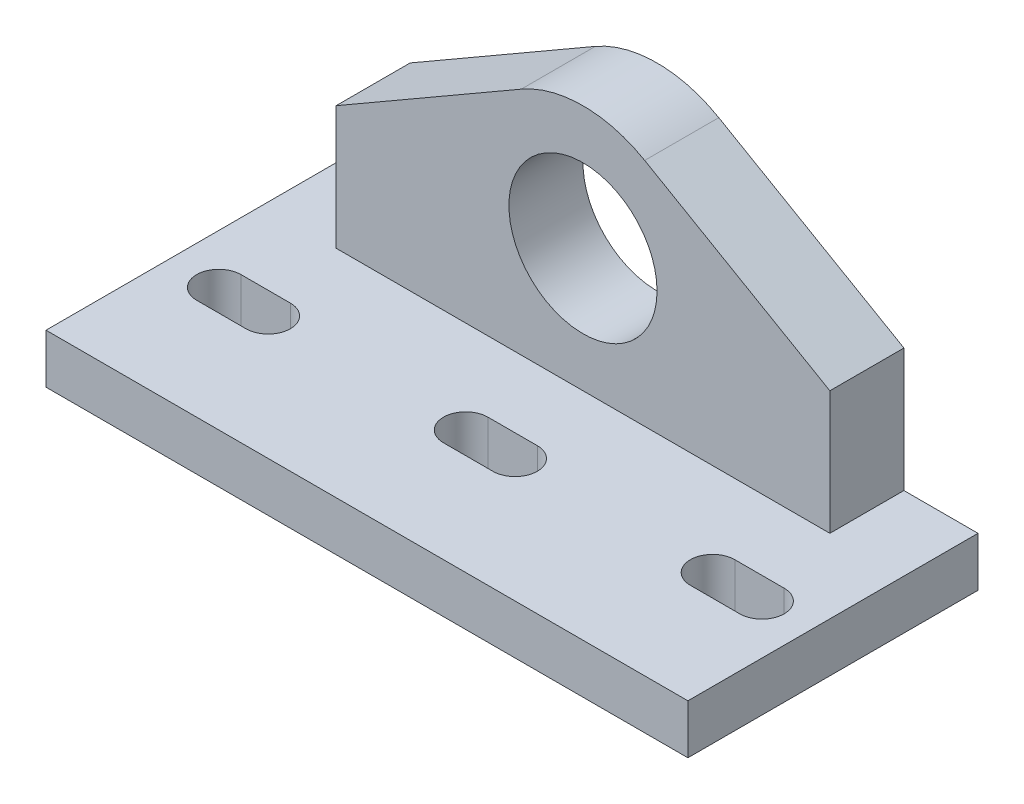
ISO-10303-21;
HEADER;
FILE_DESCRIPTION(('STEP AP214'),'2;1');
FILE_NAME('part.step','',(''),(''),'','','');
FILE_SCHEMA(('AUTOMOTIVE_DESIGN { 1 0 10303 214 1 1 1 1 }'));
ENDSEC;
DATA;
#1=APPLICATION_CONTEXT('core data for automotive mechanical design processes');
#2=APPLICATION_PROTOCOL_DEFINITION('international standard','automotive_design',2000,#1);
#3=PRODUCT_CONTEXT('',#1,'mechanical');
#4=PRODUCT('Part','Part','',(#3));
#5=PRODUCT_RELATED_PRODUCT_CATEGORY('part','',(#4));
#6=PRODUCT_DEFINITION_FORMATION('','',#4);
#7=PRODUCT_DEFINITION_CONTEXT('part definition',#1,'design');
#8=PRODUCT_DEFINITION('design','',#6,#7);
#9=PRODUCT_DEFINITION_SHAPE('','',#8);
#10=(LENGTH_UNIT() NAMED_UNIT(*) SI_UNIT(.MILLI.,.METRE.));
#11=(NAMED_UNIT(*) PLANE_ANGLE_UNIT() SI_UNIT($,.RADIAN.));
#12=(NAMED_UNIT(*) SI_UNIT($,.STERADIAN.) SOLID_ANGLE_UNIT());
#13=UNCERTAINTY_MEASURE_WITH_UNIT(LENGTH_MEASURE(1.E-05),#10,'distance_accuracy_value','');
#14=(GEOMETRIC_REPRESENTATION_CONTEXT(3) GLOBAL_UNCERTAINTY_ASSIGNED_CONTEXT((#13)) GLOBAL_UNIT_ASSIGNED_CONTEXT((#10,
#11,#12)) REPRESENTATION_CONTEXT('',''));
#15=CARTESIAN_POINT('',(0.,0.,0.));
#16=DIRECTION('',(0.,0.,1.));
#17=DIRECTION('',(1.,0.,0.));
#18=AXIS2_PLACEMENT_3D('',#15,#16,#17);
#19=CARTESIAN_POINT('',(220.,0.,76.5));
#20=DIRECTION('',(0.,0.,1.));
#21=DIRECTION('',(1.,0.,0.));
#22=AXIS2_PLACEMENT_3D('',#19,#20,#21);
#23=PLANE('',#22);
#24=DIRECTION('',(1.,0.,0.));
#25=VECTOR('',#24,1.);
#26=CARTESIAN_POINT('',(220.,20.,76.5));
#27=LINE('',#26,#25);
#28=CARTESIAN_POINT('',(220.,20.,76.5));
#29=VERTEX_POINT('',#28);
#30=CARTESIAN_POINT('',(240.,20.,76.5));
#31=VERTEX_POINT('',#30);
#32=EDGE_CURVE('E324',#29,#31,#27,.T.);
#33=ORIENTED_EDGE('',*,*,#32,.T.);
#34=DIRECTION('',(0.,1.,0.));
#35=VECTOR('',#34,1.);
#36=CARTESIAN_POINT('',(240.,0.,76.5));
#37=LINE('',#36,#35);
#38=CARTESIAN_POINT('',(240.,0.,76.5));
#39=VERTEX_POINT('',#38);
#40=EDGE_CURVE('E11',#39,#31,#37,.T.);
#41=ORIENTED_EDGE('',*,*,#40,.F.);
#42=DIRECTION('',(1.,0.,0.));
#43=VECTOR('',#42,1.);
#44=CARTESIAN_POINT('',(220.,0.,76.5));
#45=LINE('',#44,#43);
#46=CARTESIAN_POINT('',(220.,0.,76.5));
#47=VERTEX_POINT('',#46);
#48=EDGE_CURVE('E329',#47,#39,#45,.T.);
#49=ORIENTED_EDGE('',*,*,#48,.F.);
#50=DIRECTION('',(0.,1.,0.));
#51=VECTOR('',#50,1.);
#52=CARTESIAN_POINT('',(220.,0.,76.5));
#53=LINE('',#52,#51);
#54=EDGE_CURVE('E336',#47,#29,#53,.T.);
#55=ORIENTED_EDGE('',*,*,#54,.T.);
#56=EDGE_LOOP('',(#33,#41,#49,#55));
#57=FACE_BOUND('',#56,.T.);
#58=ADVANCED_FACE('F35',(#57),#23,.F.);
#59=CARTESIAN_POINT('',(240.,0.,67.5));
#60=DIRECTION('',(0.,1.,0.));
#61=DIRECTION('',(0.,0.,1.));
#62=AXIS2_PLACEMENT_3D('',#59,#60,#61);
#63=CYLINDRICAL_SURFACE('',#62,9.00000000000001);
#64=CARTESIAN_POINT('',(240.,20.,67.5));
#65=DIRECTION('',(0.,1.,0.));
#66=DIRECTION('',(0.,0.,1.));
#67=AXIS2_PLACEMENT_3D('',#64,#65,#66);
#68=CIRCLE('',#67,9.00000000000001);
#69=CARTESIAN_POINT('',(240.,20.,58.5));
#70=VERTEX_POINT('',#69);
#71=EDGE_CURVE('E321',#31,#70,#68,.T.);
#72=ORIENTED_EDGE('',*,*,#71,.T.);
#73=DIRECTION('',(0.,1.,0.));
#74=VECTOR('',#73,1.);
#75=CARTESIAN_POINT('',(240.,0.,58.5));
#76=LINE('',#75,#74);
#77=CARTESIAN_POINT('',(240.,0.,58.5));
#78=VERTEX_POINT('',#77);
#79=EDGE_CURVE('E42',#78,#70,#76,.T.);
#80=ORIENTED_EDGE('',*,*,#79,.F.);
#81=CARTESIAN_POINT('',(240.,0.,67.5));
#82=DIRECTION('',(0.,1.,0.));
#83=DIRECTION('',(0.,0.,1.));
#84=AXIS2_PLACEMENT_3D('',#81,#82,#83);
#85=CIRCLE('',#84,9.00000000000001);
#86=EDGE_CURVE('E331',#39,#78,#85,.T.);
#87=ORIENTED_EDGE('',*,*,#86,.F.);
#88=ORIENTED_EDGE('',*,*,#40,.T.);
#89=EDGE_LOOP('',(#72,#80,#87,#88));
#90=FACE_BOUND('',#89,.T.);
#91=ADVANCED_FACE('F349',(#90),#63,.F.);
#92=CARTESIAN_POINT('',(220.,0.,58.5));
#93=DIRECTION('',(0.,0.,-1.));
#94=DIRECTION('',(-1.,0.,0.));
#95=AXIS2_PLACEMENT_3D('',#92,#93,#94);
#96=PLANE('',#95);
#97=DIRECTION('',(-1.,0.,0.));
#98=VECTOR('',#97,1.);
#99=CARTESIAN_POINT('',(220.,20.,58.5));
#100=LINE('',#99,#98);
#101=CARTESIAN_POINT('',(220.,20.,58.5));
#102=VERTEX_POINT('',#101);
#103=EDGE_CURVE('E318',#70,#102,#100,.T.);
#104=ORIENTED_EDGE('',*,*,#103,.T.);
#105=DIRECTION('',(0.,1.,0.));
#106=VECTOR('',#105,1.);
#107=CARTESIAN_POINT('',(220.,0.,58.5));
#108=LINE('',#107,#106);
#109=CARTESIAN_POINT('',(220.,0.,58.5));
#110=VERTEX_POINT('',#109);
#111=EDGE_CURVE('E339',#110,#102,#108,.T.);
#112=ORIENTED_EDGE('',*,*,#111,.F.);
#113=DIRECTION('',(-1.,0.,0.));
#114=VECTOR('',#113,1.);
#115=CARTESIAN_POINT('',(220.,0.,58.5));
#116=LINE('',#115,#114);
#117=EDGE_CURVE('E333',#78,#110,#116,.T.);
#118=ORIENTED_EDGE('',*,*,#117,.F.);
#119=ORIENTED_EDGE('',*,*,#79,.T.);
#120=EDGE_LOOP('',(#104,#112,#118,#119));
#121=FACE_BOUND('',#120,.T.);
#122=ADVANCED_FACE('F345',(#121),#96,.F.);
#123=CARTESIAN_POINT('',(220.,0.,67.5));
#124=DIRECTION('',(0.,1.,0.));
#125=DIRECTION('',(0.,0.,1.));
#126=AXIS2_PLACEMENT_3D('',#123,#124,#125);
#127=CYLINDRICAL_SURFACE('',#126,9.00000000000001);
#128=CARTESIAN_POINT('',(220.,20.,67.5));
#129=DIRECTION('',(0.,1.,0.));
#130=DIRECTION('',(0.,0.,1.));
#131=AXIS2_PLACEMENT_3D('',#128,#129,#130);
#132=CIRCLE('',#131,9.00000000000001);
#133=EDGE_CURVE('E316',#102,#29,#132,.T.);
#134=ORIENTED_EDGE('',*,*,#133,.T.);
#135=ORIENTED_EDGE('',*,*,#54,.F.);
#136=CARTESIAN_POINT('',(220.,0.,67.5));
#137=DIRECTION('',(0.,1.,0.));
#138=DIRECTION('',(0.,0.,1.));
#139=AXIS2_PLACEMENT_3D('',#136,#137,#138);
#140=CIRCLE('',#139,9.00000000000001);
#141=EDGE_CURVE('E327',#110,#47,#140,.T.);
#142=ORIENTED_EDGE('',*,*,#141,.F.);
#143=ORIENTED_EDGE('',*,*,#111,.T.);
#144=EDGE_LOOP('',(#134,#135,#142,#143));
#145=FACE_BOUND('',#144,.T.);
#146=ADVANCED_FACE('F358',(#145),#127,.F.);
#147=CARTESIAN_POINT('',(0.,20.,0.));
#148=DIRECTION('',(1.,0.,0.));
#149=DIRECTION('',(0.,0.,-1.));
#150=AXIS2_PLACEMENT_3D('',#147,#148,#149);
#151=PLANE('',#150);
#152=DIRECTION('',(0.,0.,1.));
#153=VECTOR('',#152,1.);
#154=CARTESIAN_POINT('',(0.,0.,0.));
#155=LINE('',#154,#153);
#156=CARTESIAN_POINT('',(0.,0.,0.));
#157=VERTEX_POINT('',#156);
#158=CARTESIAN_POINT('',(0.,0.,117.5));
#159=VERTEX_POINT('',#158);
#160=EDGE_CURVE('E279',#157,#159,#155,.T.);
#161=ORIENTED_EDGE('',*,*,#160,.T.);
#162=DIRECTION('',(0.,-1.,0.));
#163=VECTOR('',#162,1.);
#164=CARTESIAN_POINT('',(0.,20.,117.5));
#165=LINE('',#164,#163);
#166=CARTESIAN_POINT('',(0.,20.,117.5));
#167=VERTEX_POINT('',#166);
#168=EDGE_CURVE('E313',#167,#159,#165,.T.);
#169=ORIENTED_EDGE('',*,*,#168,.F.);
#170=DIRECTION('',(0.,0.,1.));
#171=VECTOR('',#170,1.);
#172=CARTESIAN_POINT('',(0.,20.,0.));
#173=LINE('',#172,#171);
#174=CARTESIAN_POINT('',(0.,20.,0.));
#175=VERTEX_POINT('',#174);
#176=EDGE_CURVE('E286',#175,#167,#173,.T.);
#177=ORIENTED_EDGE('',*,*,#176,.F.);
#178=DIRECTION('',(0.,-1.,0.));
#179=VECTOR('',#178,1.);
#180=CARTESIAN_POINT('',(0.,20.,0.));
#181=LINE('',#180,#179);
#182=EDGE_CURVE('E297',#175,#157,#181,.T.);
#183=ORIENTED_EDGE('',*,*,#182,.T.);
#184=EDGE_LOOP('',(#161,#169,#177,#183));
#185=FACE_BOUND('',#184,.T.);
#186=ADVANCED_FACE('F387',(#185),#151,.F.);
#187=CARTESIAN_POINT('',(0.,20.,117.5));
#188=DIRECTION('',(0.,0.,-1.));
#189=DIRECTION('',(-1.,0.,0.));
#190=AXIS2_PLACEMENT_3D('',#187,#188,#189);
#191=PLANE('',#190);
#192=DIRECTION('',(1.,0.,0.));
#193=VECTOR('',#192,1.);
#194=CARTESIAN_POINT('',(0.,0.,117.5));
#195=LINE('',#194,#193);
#196=CARTESIAN_POINT('',(260.,0.,117.5));
#197=VERTEX_POINT('',#196);
#198=EDGE_CURVE('E300',#159,#197,#195,.T.);
#199=ORIENTED_EDGE('',*,*,#198,.T.);
#200=DIRECTION('',(0.,-1.,0.));
#201=VECTOR('',#200,1.);
#202=CARTESIAN_POINT('',(260.,20.,117.5));
#203=LINE('',#202,#201);
#204=CARTESIAN_POINT('',(260.,20.,117.5));
#205=VERTEX_POINT('',#204);
#206=EDGE_CURVE('E310',#205,#197,#203,.T.);
#207=ORIENTED_EDGE('',*,*,#206,.F.);
#208=DIRECTION('',(1.,0.,0.));
#209=VECTOR('',#208,1.);
#210=CARTESIAN_POINT('',(0.,20.,117.5));
#211=LINE('',#210,#209);
#212=EDGE_CURVE('E289',#167,#205,#211,.T.);
#213=ORIENTED_EDGE('',*,*,#212,.F.);
#214=ORIENTED_EDGE('',*,*,#168,.T.);
#215=EDGE_LOOP('',(#199,#207,#213,#214));
#216=FACE_BOUND('',#215,.T.);
#217=ADVANCED_FACE('F390',(#216),#191,.F.);
#218=CARTESIAN_POINT('',(260.,20.,0.));
#219=DIRECTION('',(-1.,0.,0.));
#220=DIRECTION('',(0.,0.,1.));
#221=AXIS2_PLACEMENT_3D('',#218,#219,#220);
#222=PLANE('',#221);
#223=DIRECTION('',(0.,0.,-1.));
#224=VECTOR('',#223,1.);
#225=CARTESIAN_POINT('',(260.,0.,0.));
#226=LINE('',#225,#224);
#227=CARTESIAN_POINT('',(260.,0.,0.));
#228=VERTEX_POINT('',#227);
#229=EDGE_CURVE('E302',#197,#228,#226,.T.);
#230=ORIENTED_EDGE('',*,*,#229,.T.);
#231=DIRECTION('',(0.,-1.,0.));
#232=VECTOR('',#231,1.);
#233=CARTESIAN_POINT('',(260.,20.,0.));
#234=LINE('',#233,#232);
#235=CARTESIAN_POINT('',(260.,20.,0.));
#236=VERTEX_POINT('',#235);
#237=EDGE_CURVE('E307',#236,#228,#234,.T.);
#238=ORIENTED_EDGE('',*,*,#237,.F.);
#239=DIRECTION('',(0.,0.,-1.));
#240=VECTOR('',#239,1.);
#241=CARTESIAN_POINT('',(260.,20.,0.));
#242=LINE('',#241,#240);
#243=EDGE_CURVE('E292',#205,#236,#242,.T.);
#244=ORIENTED_EDGE('',*,*,#243,.F.);
#245=ORIENTED_EDGE('',*,*,#206,.T.);
#246=EDGE_LOOP('',(#230,#238,#244,#245));
#247=FACE_BOUND('',#246,.T.);
#248=ADVANCED_FACE('F394',(#247),#222,.F.);
#249=CARTESIAN_POINT('',(0.,20.,0.));
#250=DIRECTION('',(0.,0.,1.));
#251=DIRECTION('',(1.,0.,0.));
#252=AXIS2_PLACEMENT_3D('',#249,#250,#251);
#253=PLANE('',#252);
#254=CARTESIAN_POINT('',(130.,70.,0.));
#255=DIRECTION('',(0.,0.,1.));
#256=DIRECTION('',(1.,0.,0.));
#257=AXIS2_PLACEMENT_3D('',#254,#255,#256);
#258=CIRCLE('',#257,30.);
#259=CARTESIAN_POINT('',(160.,70.,0.));
#260=VERTEX_POINT('',#259);
#261=EDGE_CURVE('E404',#260,#260,#258,.T.);
#262=ORIENTED_EDGE('',*,*,#261,.T.);
#263=EDGE_LOOP('',(#262));
#264=FACE_BOUND('',#263,.T.);
#265=CARTESIAN_POINT('',(130.,70.,0.));
#266=DIRECTION('',(0.,0.,-1.));
#267=DIRECTION('',(-1.,0.,0.));
#268=AXIS2_PLACEMENT_3D('',#265,#266,#267);
#269=CIRCLE('',#268,50.);
#270=CARTESIAN_POINT('',(105.,113.301270189222,0.));
#271=VERTEX_POINT('',#270);
#272=CARTESIAN_POINT('',(155.,113.301270189222,0.));
#273=VERTEX_POINT('',#272);
#274=EDGE_CURVE('E196',#271,#273,#269,.T.);
#275=ORIENTED_EDGE('',*,*,#274,.T.);
#276=DIRECTION('',(0.866025403784439,-0.5,0.));
#277=VECTOR('',#276,1.);
#278=CARTESIAN_POINT('',(230.,70.,0.));
#279=LINE('',#278,#277);
#280=CARTESIAN_POINT('',(230.,70.,0.));
#281=VERTEX_POINT('',#280);
#282=EDGE_CURVE('E203',#273,#281,#279,.T.);
#283=ORIENTED_EDGE('',*,*,#282,.T.);
#284=DIRECTION('',(0.,-1.,0.));
#285=VECTOR('',#284,1.);
#286=CARTESIAN_POINT('',(230.,120.,0.));
#287=LINE('',#286,#285);
#288=CARTESIAN_POINT('',(230.,20.,0.));
#289=VERTEX_POINT('',#288);
#290=EDGE_CURVE('E209',#281,#289,#287,.T.);
#291=ORIENTED_EDGE('',*,*,#290,.T.);
#292=DIRECTION('',(-1.,0.,0.));
#293=VECTOR('',#292,1.);
#294=CARTESIAN_POINT('',(0.,20.,0.));
#295=LINE('',#294,#293);
#296=EDGE_CURVE('E294',#236,#289,#295,.T.);
#297=ORIENTED_EDGE('',*,*,#296,.F.);
#298=ORIENTED_EDGE('',*,*,#237,.T.);
#299=DIRECTION('',(-1.,0.,0.));
#300=VECTOR('',#299,1.);
#301=CARTESIAN_POINT('',(0.,0.,0.));
#302=LINE('',#301,#300);
#303=EDGE_CURVE('E290',#228,#157,#302,.T.);
#304=ORIENTED_EDGE('',*,*,#303,.T.);
#305=ORIENTED_EDGE('',*,*,#182,.F.);
#306=CARTESIAN_POINT('',(30.,20.,0.));
#307=VERTEX_POINT('',#306);
#308=EDGE_CURVE('E208',#307,#175,#295,.T.);
#309=ORIENTED_EDGE('',*,*,#308,.F.);
#310=DIRECTION('',(0.,-1.,0.));
#311=VECTOR('',#310,1.);
#312=CARTESIAN_POINT('',(30.,120.,0.));
#313=LINE('',#312,#311);
#314=CARTESIAN_POINT('',(30.,70.,0.));
#315=VERTEX_POINT('',#314);
#316=EDGE_CURVE('E201',#315,#307,#313,.T.);
#317=ORIENTED_EDGE('',*,*,#316,.F.);
#318=DIRECTION('',(0.866025403784439,0.5,0.));
#319=VECTOR('',#318,1.);
#320=CARTESIAN_POINT('',(30.,70.,0.));
#321=LINE('',#320,#319);
#322=EDGE_CURVE('E186',#315,#271,#321,.T.);
#323=ORIENTED_EDGE('',*,*,#322,.T.);
#324=EDGE_LOOP('',(#275,#283,#291,#297,#298,#304,#305,#309,#317,#323));
#325=FACE_BOUND('',#324,.T.);
#326=ADVANCED_FACE('F206',(#264,#325),#253,.F.);
#327=CARTESIAN_POINT('',(0.,20.,0.));
#328=DIRECTION('',(0.,1.,0.));
#329=DIRECTION('',(0.,0.,1.));
#330=AXIS2_PLACEMENT_3D('',#327,#328,#329);
#331=PLANE('',#330);
#332=DIRECTION('',(0.,0.,1.));
#333=VECTOR('',#332,1.);
#334=CARTESIAN_POINT('',(30.,20.,0.));
#335=LINE('',#334,#333);
#336=CARTESIAN_POINT('',(30.,20.,30.));
#337=VERTEX_POINT('',#336);
#338=EDGE_CURVE('E406',#307,#337,#335,.T.);
#339=ORIENTED_EDGE('',*,*,#338,.F.);
#340=ORIENTED_EDGE('',*,*,#308,.T.);
#341=ORIENTED_EDGE('',*,*,#176,.T.);
#342=ORIENTED_EDGE('',*,*,#212,.T.);
#343=ORIENTED_EDGE('',*,*,#243,.T.);
#344=ORIENTED_EDGE('',*,*,#296,.T.);
#345=DIRECTION('',(0.,0.,-1.));
#346=VECTOR('',#345,1.);
#347=CARTESIAN_POINT('',(230.,20.,0.));
#348=LINE('',#347,#346);
#349=CARTESIAN_POINT('',(230.,20.,30.));
#350=VERTEX_POINT('',#349);
#351=EDGE_CURVE('E210',#350,#289,#348,.T.);
#352=ORIENTED_EDGE('',*,*,#351,.F.);
#353=DIRECTION('',(1.,0.,0.));
#354=VECTOR('',#353,1.);
#355=CARTESIAN_POINT('',(30.,20.,30.));
#356=LINE('',#355,#354);
#357=EDGE_CURVE('E215',#337,#350,#356,.T.);
#358=ORIENTED_EDGE('',*,*,#357,.F.);
#359=EDGE_LOOP('',(#339,#340,#341,#342,#343,#344,#352,#358));
#360=FACE_BOUND('',#359,.T.);
#361=CARTESIAN_POINT('',(120.,20.,67.5));
#362=DIRECTION('',(0.,1.,0.));
#363=DIRECTION('',(0.,0.,1.));
#364=AXIS2_PLACEMENT_3D('',#361,#362,#363);
#365=CIRCLE('',#364,9.00000000000001);
#366=CARTESIAN_POINT('',(120.,20.,58.5));
#367=VERTEX_POINT('',#366);
#368=CARTESIAN_POINT('',(120.,20.,76.5));
#369=VERTEX_POINT('',#368);
#370=EDGE_CURVE('E248',#367,#369,#365,.T.);
#371=ORIENTED_EDGE('',*,*,#370,.F.);
#372=DIRECTION('',(-1.,0.,0.));
#373=VECTOR('',#372,1.);
#374=CARTESIAN_POINT('',(120.,20.,58.5));
#375=LINE('',#374,#373);
#376=CARTESIAN_POINT('',(140.,20.,58.5));
#377=VERTEX_POINT('',#376);
#378=EDGE_CURVE('E240',#377,#367,#375,.T.);
#379=ORIENTED_EDGE('',*,*,#378,.F.);
#380=CARTESIAN_POINT('',(140.,20.,67.5));
#381=DIRECTION('',(0.,1.,0.));
#382=DIRECTION('',(0.,0.,1.));
#383=AXIS2_PLACEMENT_3D('',#380,#381,#382);
#384=CIRCLE('',#383,9.00000000000001);
#385=CARTESIAN_POINT('',(140.,20.,76.5));
#386=VERTEX_POINT('',#385);
#387=EDGE_CURVE('E232',#386,#377,#384,.T.);
#388=ORIENTED_EDGE('',*,*,#387,.F.);
#389=DIRECTION('',(1.,0.,0.));
#390=VECTOR('',#389,1.);
#391=CARTESIAN_POINT('',(120.,20.,76.5));
#392=LINE('',#391,#390);
#393=EDGE_CURVE('E221',#369,#386,#392,.T.);
#394=ORIENTED_EDGE('',*,*,#393,.F.);
#395=EDGE_LOOP('',(#371,#379,#388,#394));
#396=FACE_BOUND('',#395,.T.);
#397=CARTESIAN_POINT('',(20.,20.,67.5));
#398=DIRECTION('',(0.,1.,0.));
#399=DIRECTION('',(0.,0.,1.));
#400=AXIS2_PLACEMENT_3D('',#397,#398,#399);
#401=CIRCLE('',#400,9.00000000000001);
#402=CARTESIAN_POINT('',(20.,20.,58.5));
#403=VERTEX_POINT('',#402);
#404=CARTESIAN_POINT('',(20.,20.,76.5));
#405=VERTEX_POINT('',#404);
#406=EDGE_CURVE('E253',#403,#405,#401,.T.);
#407=ORIENTED_EDGE('',*,*,#406,.F.);
#408=DIRECTION('',(-1.,0.,0.));
#409=VECTOR('',#408,1.);
#410=CARTESIAN_POINT('',(20.,20.,58.5));
#411=LINE('',#410,#409);
#412=CARTESIAN_POINT('',(40.,20.,58.5));
#413=VERTEX_POINT('',#412);
#414=EDGE_CURVE('E258',#413,#403,#411,.T.);
#415=ORIENTED_EDGE('',*,*,#414,.F.);
#416=CARTESIAN_POINT('',(40.,20.,67.5));
#417=DIRECTION('',(0.,1.,0.));
#418=DIRECTION('',(0.,0.,1.));
#419=AXIS2_PLACEMENT_3D('',#416,#417,#418);
#420=CIRCLE('',#419,9.00000000000001);
#421=CARTESIAN_POINT('',(40.,20.,76.5));
#422=VERTEX_POINT('',#421);
#423=EDGE_CURVE('E272',#422,#413,#420,.T.);
#424=ORIENTED_EDGE('',*,*,#423,.F.);
#425=DIRECTION('',(1.,0.,0.));
#426=VECTOR('',#425,1.);
#427=CARTESIAN_POINT('',(20.,20.,76.5));
#428=LINE('',#427,#426);
#429=EDGE_CURVE('E269',#405,#422,#428,.T.);
#430=ORIENTED_EDGE('',*,*,#429,.F.);
#431=EDGE_LOOP('',(#407,#415,#424,#430));
#432=FACE_BOUND('',#431,.T.);
#433=ORIENTED_EDGE('',*,*,#133,.F.);
#434=ORIENTED_EDGE('',*,*,#103,.F.);
#435=ORIENTED_EDGE('',*,*,#71,.F.);
#436=ORIENTED_EDGE('',*,*,#32,.F.);
#437=EDGE_LOOP('',(#433,#434,#435,#436));
#438=FACE_BOUND('',#437,.T.);
#439=ADVANCED_FACE('F353',(#360,#396,#432,#438),#331,.T.);
#440=CARTESIAN_POINT('',(0.,0.,0.));
#441=DIRECTION('',(0.,1.,0.));
#442=DIRECTION('',(0.,0.,1.));
#443=AXIS2_PLACEMENT_3D('',#440,#441,#442);
#444=PLANE('',#443);
#445=DIRECTION('',(-1.,0.,0.));
#446=VECTOR('',#445,1.);
#447=CARTESIAN_POINT('',(120.,0.,58.5));
#448=LINE('',#447,#446);
#449=CARTESIAN_POINT('',(140.,0.,58.5));
#450=VERTEX_POINT('',#449);
#451=CARTESIAN_POINT('',(120.,0.,58.5));
#452=VERTEX_POINT('',#451);
#453=EDGE_CURVE('E245',#450,#452,#448,.T.);
#454=ORIENTED_EDGE('',*,*,#453,.T.);
#455=CARTESIAN_POINT('',(120.,0.,67.5));
#456=DIRECTION('',(0.,1.,0.));
#457=DIRECTION('',(0.,0.,1.));
#458=AXIS2_PLACEMENT_3D('',#455,#456,#457);
#459=CIRCLE('',#458,9.00000000000001);
#460=CARTESIAN_POINT('',(120.,0.,76.5));
#461=VERTEX_POINT('',#460);
#462=EDGE_CURVE('E250',#452,#461,#459,.T.);
#463=ORIENTED_EDGE('',*,*,#462,.T.);
#464=DIRECTION('',(1.,0.,0.));
#465=VECTOR('',#464,1.);
#466=CARTESIAN_POINT('',(120.,0.,76.5));
#467=LINE('',#466,#465);
#468=CARTESIAN_POINT('',(140.,0.,76.5));
#469=VERTEX_POINT('',#468);
#470=EDGE_CURVE('E223',#461,#469,#467,.T.);
#471=ORIENTED_EDGE('',*,*,#470,.T.);
#472=CARTESIAN_POINT('',(140.,0.,67.5));
#473=DIRECTION('',(0.,1.,0.));
#474=DIRECTION('',(0.,0.,1.));
#475=AXIS2_PLACEMENT_3D('',#472,#473,#474);
#476=CIRCLE('',#475,9.00000000000001);
#477=EDGE_CURVE('E237',#469,#450,#476,.T.);
#478=ORIENTED_EDGE('',*,*,#477,.T.);
#479=EDGE_LOOP('',(#454,#463,#471,#478));
#480=FACE_BOUND('',#479,.T.);
#481=DIRECTION('',(-1.,0.,0.));
#482=VECTOR('',#481,1.);
#483=CARTESIAN_POINT('',(20.,0.,58.5));
#484=LINE('',#483,#482);
#485=CARTESIAN_POINT('',(40.,0.,58.5));
#486=VERTEX_POINT('',#485);
#487=CARTESIAN_POINT('',(20.,0.,58.5));
#488=VERTEX_POINT('',#487);
#489=EDGE_CURVE('E264',#486,#488,#484,.T.);
#490=ORIENTED_EDGE('',*,*,#489,.T.);
#491=CARTESIAN_POINT('',(20.,0.,67.5));
#492=DIRECTION('',(0.,1.,0.));
#493=DIRECTION('',(0.,0.,1.));
#494=AXIS2_PLACEMENT_3D('',#491,#492,#493);
#495=CIRCLE('',#494,9.00000000000001);
#496=CARTESIAN_POINT('',(20.,0.,76.5));
#497=VERTEX_POINT('',#496);
#498=EDGE_CURVE('E254',#488,#497,#495,.T.);
#499=ORIENTED_EDGE('',*,*,#498,.T.);
#500=DIRECTION('',(1.,0.,0.));
#501=VECTOR('',#500,1.);
#502=CARTESIAN_POINT('',(20.,0.,76.5));
#503=LINE('',#502,#501);
#504=CARTESIAN_POINT('',(40.,0.,76.5));
#505=VERTEX_POINT('',#504);
#506=EDGE_CURVE('E257',#497,#505,#503,.T.);
#507=ORIENTED_EDGE('',*,*,#506,.T.);
#508=CARTESIAN_POINT('',(40.,0.,67.5));
#509=DIRECTION('',(0.,1.,0.));
#510=DIRECTION('',(0.,0.,1.));
#511=AXIS2_PLACEMENT_3D('',#508,#509,#510);
#512=CIRCLE('',#511,9.00000000000001);
#513=EDGE_CURVE('E261',#505,#486,#512,.T.);
#514=ORIENTED_EDGE('',*,*,#513,.T.);
#515=EDGE_LOOP('',(#490,#499,#507,#514));
#516=FACE_BOUND('',#515,.T.);
#517=ORIENTED_EDGE('',*,*,#160,.F.);
#518=ORIENTED_EDGE('',*,*,#303,.F.);
#519=ORIENTED_EDGE('',*,*,#229,.F.);
#520=ORIENTED_EDGE('',*,*,#198,.F.);
#521=EDGE_LOOP('',(#517,#518,#519,#520));
#522=FACE_BOUND('',#521,.T.);
#523=ORIENTED_EDGE('',*,*,#141,.T.);
#524=ORIENTED_EDGE('',*,*,#48,.T.);
#525=ORIENTED_EDGE('',*,*,#86,.T.);
#526=ORIENTED_EDGE('',*,*,#117,.T.);
#527=EDGE_LOOP('',(#523,#524,#525,#526));
#528=FACE_BOUND('',#527,.T.);
#529=ADVANCED_FACE('F360',(#480,#516,#522,#528),#444,.F.);
#530=CARTESIAN_POINT('',(20.,0.,67.5));
#531=DIRECTION('',(0.,1.,0.));
#532=DIRECTION('',(0.,0.,1.));
#533=AXIS2_PLACEMENT_3D('',#530,#531,#532);
#534=CYLINDRICAL_SURFACE('',#533,9.00000000000001);
#535=ORIENTED_EDGE('',*,*,#406,.T.);
#536=DIRECTION('',(0.,1.,0.));
#537=VECTOR('',#536,1.);
#538=CARTESIAN_POINT('',(20.,0.,76.5));
#539=LINE('',#538,#537);
#540=EDGE_CURVE('E267',#497,#405,#539,.T.);
#541=ORIENTED_EDGE('',*,*,#540,.F.);
#542=ORIENTED_EDGE('',*,*,#498,.F.);
#543=DIRECTION('',(0.,1.,0.));
#544=VECTOR('',#543,1.);
#545=CARTESIAN_POINT('',(20.,0.,58.5));
#546=LINE('',#545,#544);
#547=EDGE_CURVE('E277',#488,#403,#546,.T.);
#548=ORIENTED_EDGE('',*,*,#547,.T.);
#549=EDGE_LOOP('',(#535,#541,#542,#548));
#550=FACE_BOUND('',#549,.T.);
#551=ADVANCED_FACE('F362',(#550),#534,.F.);
#552=CARTESIAN_POINT('',(20.,0.,58.5));
#553=DIRECTION('',(0.,0.,-1.));
#554=DIRECTION('',(-1.,0.,0.));
#555=AXIS2_PLACEMENT_3D('',#552,#553,#554);
#556=PLANE('',#555);
#557=ORIENTED_EDGE('',*,*,#414,.T.);
#558=ORIENTED_EDGE('',*,*,#547,.F.);
#559=ORIENTED_EDGE('',*,*,#489,.F.);
#560=DIRECTION('',(0.,1.,0.));
#561=VECTOR('',#560,1.);
#562=CARTESIAN_POINT('',(40.,0.,58.5));
#563=LINE('',#562,#561);
#564=EDGE_CURVE('E280',#486,#413,#563,.T.);
#565=ORIENTED_EDGE('',*,*,#564,.T.);
#566=EDGE_LOOP('',(#557,#558,#559,#565));
#567=FACE_BOUND('',#566,.T.);
#568=ADVANCED_FACE('F369',(#567),#556,.F.);
#569=CARTESIAN_POINT('',(40.,0.,67.5));
#570=DIRECTION('',(0.,1.,0.));
#571=DIRECTION('',(0.,0.,1.));
#572=AXIS2_PLACEMENT_3D('',#569,#570,#571);
#573=CYLINDRICAL_SURFACE('',#572,9.00000000000001);
#574=ORIENTED_EDGE('',*,*,#423,.T.);
#575=ORIENTED_EDGE('',*,*,#564,.F.);
#576=ORIENTED_EDGE('',*,*,#513,.F.);
#577=DIRECTION('',(0.,1.,0.));
#578=VECTOR('',#577,1.);
#579=CARTESIAN_POINT('',(40.,0.,76.5));
#580=LINE('',#579,#578);
#581=EDGE_CURVE('E282',#505,#422,#580,.T.);
#582=ORIENTED_EDGE('',*,*,#581,.T.);
#583=EDGE_LOOP('',(#574,#575,#576,#582));
#584=FACE_BOUND('',#583,.T.);
#585=ADVANCED_FACE('F475',(#584),#573,.F.);
#586=CARTESIAN_POINT('',(20.,0.,76.5));
#587=DIRECTION('',(0.,0.,1.));
#588=DIRECTION('',(1.,0.,0.));
#589=AXIS2_PLACEMENT_3D('',#586,#587,#588);
#590=PLANE('',#589);
#591=ORIENTED_EDGE('',*,*,#429,.T.);
#592=ORIENTED_EDGE('',*,*,#581,.F.);
#593=ORIENTED_EDGE('',*,*,#506,.F.);
#594=ORIENTED_EDGE('',*,*,#540,.T.);
#595=EDGE_LOOP('',(#591,#592,#593,#594));
#596=FACE_BOUND('',#595,.T.);
#597=ADVANCED_FACE('F471',(#596),#590,.F.);
#598=CARTESIAN_POINT('',(120.,0.,67.5));
#599=DIRECTION('',(0.,1.,0.));
#600=DIRECTION('',(0.,0.,1.));
#601=AXIS2_PLACEMENT_3D('',#598,#599,#600);
#602=CYLINDRICAL_SURFACE('',#601,9.00000000000001);
#603=ORIENTED_EDGE('',*,*,#370,.T.);
#604=DIRECTION('',(0.,1.,0.));
#605=VECTOR('',#604,1.);
#606=CARTESIAN_POINT('',(120.,0.,76.5));
#607=LINE('',#606,#605);
#608=EDGE_CURVE('E229',#461,#369,#607,.T.);
#609=ORIENTED_EDGE('',*,*,#608,.F.);
#610=ORIENTED_EDGE('',*,*,#462,.F.);
#611=DIRECTION('',(0.,1.,0.));
#612=VECTOR('',#611,1.);
#613=CARTESIAN_POINT('',(120.,0.,58.5));
#614=LINE('',#613,#612);
#615=EDGE_CURVE('E242',#452,#367,#614,.T.);
#616=ORIENTED_EDGE('',*,*,#615,.T.);
#617=EDGE_LOOP('',(#603,#609,#610,#616));
#618=FACE_BOUND('',#617,.T.);
#619=ADVANCED_FACE('F467',(#618),#602,.F.);
#620=CARTESIAN_POINT('',(120.,0.,58.5));
#621=DIRECTION('',(0.,0.,-1.));
#622=DIRECTION('',(-1.,0.,0.));
#623=AXIS2_PLACEMENT_3D('',#620,#621,#622);
#624=PLANE('',#623);
#625=ORIENTED_EDGE('',*,*,#378,.T.);
#626=ORIENTED_EDGE('',*,*,#615,.F.);
#627=ORIENTED_EDGE('',*,*,#453,.F.);
#628=DIRECTION('',(0.,1.,0.));
#629=VECTOR('',#628,1.);
#630=CARTESIAN_POINT('',(140.,0.,58.5));
#631=LINE('',#630,#629);
#632=EDGE_CURVE('E234',#450,#377,#631,.T.);
#633=ORIENTED_EDGE('',*,*,#632,.T.);
#634=EDGE_LOOP('',(#625,#626,#627,#633));
#635=FACE_BOUND('',#634,.T.);
#636=ADVANCED_FACE('F463',(#635),#624,.F.);
#637=CARTESIAN_POINT('',(140.,0.,67.5));
#638=DIRECTION('',(0.,1.,0.));
#639=DIRECTION('',(0.,0.,1.));
#640=AXIS2_PLACEMENT_3D('',#637,#638,#639);
#641=CYLINDRICAL_SURFACE('',#640,9.00000000000001);
#642=ORIENTED_EDGE('',*,*,#387,.T.);
#643=ORIENTED_EDGE('',*,*,#632,.F.);
#644=ORIENTED_EDGE('',*,*,#477,.F.);
#645=DIRECTION('',(0.,1.,0.));
#646=VECTOR('',#645,1.);
#647=CARTESIAN_POINT('',(140.,0.,76.5));
#648=LINE('',#647,#646);
#649=EDGE_CURVE('E226',#469,#386,#648,.T.);
#650=ORIENTED_EDGE('',*,*,#649,.T.);
#651=EDGE_LOOP('',(#642,#643,#644,#650));
#652=FACE_BOUND('',#651,.T.);
#653=ADVANCED_FACE('F459',(#652),#641,.F.);
#654=CARTESIAN_POINT('',(120.,0.,76.5));
#655=DIRECTION('',(0.,0.,1.));
#656=DIRECTION('',(1.,0.,0.));
#657=AXIS2_PLACEMENT_3D('',#654,#655,#656);
#658=PLANE('',#657);
#659=ORIENTED_EDGE('',*,*,#393,.T.);
#660=ORIENTED_EDGE('',*,*,#649,.F.);
#661=ORIENTED_EDGE('',*,*,#470,.F.);
#662=ORIENTED_EDGE('',*,*,#608,.T.);
#663=EDGE_LOOP('',(#659,#660,#661,#662));
#664=FACE_BOUND('',#663,.T.);
#665=ADVANCED_FACE('F456',(#664),#658,.F.);
#666=CARTESIAN_POINT('',(30.,120.,0.));
#667=DIRECTION('',(1.,0.,0.));
#668=DIRECTION('',(0.,0.,-1.));
#669=AXIS2_PLACEMENT_3D('',#666,#667,#668);
#670=PLANE('',#669);
#671=DIRECTION('',(0.,-1.,0.));
#672=VECTOR('',#671,1.);
#673=CARTESIAN_POINT('',(30.,120.,30.));
#674=LINE('',#673,#672);
#675=CARTESIAN_POINT('',(30.,70.,30.));
#676=VERTEX_POINT('',#675);
#677=EDGE_CURVE('E57',#676,#337,#674,.T.);
#678=ORIENTED_EDGE('',*,*,#677,.F.);
#679=DIRECTION('',(0.,0.,1.));
#680=VECTOR('',#679,1.);
#681=CARTESIAN_POINT('',(30.,70.,0.));
#682=LINE('',#681,#680);
#683=EDGE_CURVE('E190',#315,#676,#682,.T.);
#684=ORIENTED_EDGE('',*,*,#683,.F.);
#685=ORIENTED_EDGE('',*,*,#316,.T.);
#686=ORIENTED_EDGE('',*,*,#338,.T.);
#687=EDGE_LOOP('',(#678,#684,#685,#686));
#688=FACE_BOUND('',#687,.T.);
#689=ADVANCED_FACE('F199',(#688),#670,.F.);
#690=CARTESIAN_POINT('',(30.,120.,30.));
#691=DIRECTION('',(0.,0.,-1.));
#692=DIRECTION('',(-1.,0.,0.));
#693=AXIS2_PLACEMENT_3D('',#690,#691,#692);
#694=PLANE('',#693);
#695=CARTESIAN_POINT('',(130.,70.,30.));
#696=DIRECTION('',(0.,0.,1.));
#697=DIRECTION('',(1.,0.,0.));
#698=AXIS2_PLACEMENT_3D('',#695,#696,#697);
#699=CIRCLE('',#698,30.);
#700=CARTESIAN_POINT('',(160.,70.,30.));
#701=VERTEX_POINT('',#700);
#702=EDGE_CURVE('E407',#701,#701,#699,.T.);
#703=ORIENTED_EDGE('',*,*,#702,.F.);
#704=EDGE_LOOP('',(#703));
#705=FACE_BOUND('',#704,.T.);
#706=DIRECTION('',(0.,-1.,0.));
#707=VECTOR('',#706,1.);
#708=CARTESIAN_POINT('',(230.,120.,30.));
#709=LINE('',#708,#707);
#710=CARTESIAN_POINT('',(230.,70.,30.));
#711=VERTEX_POINT('',#710);
#712=EDGE_CURVE('E212',#711,#350,#709,.T.);
#713=ORIENTED_EDGE('',*,*,#712,.F.);
#714=DIRECTION('',(0.866025403784439,-0.5,0.));
#715=VECTOR('',#714,1.);
#716=CARTESIAN_POINT('',(230.,70.,30.));
#717=LINE('',#716,#715);
#718=CARTESIAN_POINT('',(155.,113.301270189222,30.));
#719=VERTEX_POINT('',#718);
#720=EDGE_CURVE('E49',#719,#711,#717,.T.);
#721=ORIENTED_EDGE('',*,*,#720,.F.);
#722=CARTESIAN_POINT('',(130.,70.,30.));
#723=DIRECTION('',(0.,0.,-1.));
#724=DIRECTION('',(-1.,0.,0.));
#725=AXIS2_PLACEMENT_3D('',#722,#723,#724);
#726=CIRCLE('',#725,50.);
#727=CARTESIAN_POINT('',(105.,113.301270189222,30.));
#728=VERTEX_POINT('',#727);
#729=EDGE_CURVE('E431',#728,#719,#726,.T.);
#730=ORIENTED_EDGE('',*,*,#729,.F.);
#731=DIRECTION('',(0.866025403784439,0.5,0.));
#732=VECTOR('',#731,1.);
#733=CARTESIAN_POINT('',(30.,70.,30.));
#734=LINE('',#733,#732);
#735=EDGE_CURVE('E432',#676,#728,#734,.T.);
#736=ORIENTED_EDGE('',*,*,#735,.F.);
#737=ORIENTED_EDGE('',*,*,#677,.T.);
#738=ORIENTED_EDGE('',*,*,#357,.T.);
#739=EDGE_LOOP('',(#713,#721,#730,#736,#737,#738));
#740=FACE_BOUND('',#739,.T.);
#741=ADVANCED_FACE('F415',(#705,#740),#694,.F.);
#742=CARTESIAN_POINT('',(230.,120.,0.));
#743=DIRECTION('',(-1.,0.,0.));
#744=DIRECTION('',(0.,0.,1.));
#745=AXIS2_PLACEMENT_3D('',#742,#743,#744);
#746=PLANE('',#745);
#747=ORIENTED_EDGE('',*,*,#290,.F.);
#748=DIRECTION('',(0.,0.,1.));
#749=VECTOR('',#748,1.);
#750=CARTESIAN_POINT('',(230.,70.,0.));
#751=LINE('',#750,#749);
#752=EDGE_CURVE('E411',#281,#711,#751,.T.);
#753=ORIENTED_EDGE('',*,*,#752,.T.);
#754=ORIENTED_EDGE('',*,*,#712,.T.);
#755=ORIENTED_EDGE('',*,*,#351,.T.);
#756=EDGE_LOOP('',(#747,#753,#754,#755));
#757=FACE_BOUND('',#756,.T.);
#758=ADVANCED_FACE('F421',(#757),#746,.F.);
#759=CARTESIAN_POINT('',(130.,70.,0.));
#760=DIRECTION('',(0.,0.,1.));
#761=DIRECTION('',(1.,0.,0.));
#762=AXIS2_PLACEMENT_3D('',#759,#760,#761);
#763=CYLINDRICAL_SURFACE('',#762,50.);
#764=ORIENTED_EDGE('',*,*,#729,.T.);
#765=DIRECTION('',(0.,0.,1.));
#766=VECTOR('',#765,1.);
#767=CARTESIAN_POINT('',(155.,113.301270189222,0.));
#768=LINE('',#767,#766);
#769=EDGE_CURVE('E424',#273,#719,#768,.T.);
#770=ORIENTED_EDGE('',*,*,#769,.F.);
#771=ORIENTED_EDGE('',*,*,#274,.F.);
#772=DIRECTION('',(0.,0.,1.));
#773=VECTOR('',#772,1.);
#774=CARTESIAN_POINT('',(105.,113.301270189222,0.));
#775=LINE('',#774,#773);
#776=EDGE_CURVE('E192',#271,#728,#775,.T.);
#777=ORIENTED_EDGE('',*,*,#776,.T.);
#778=EDGE_LOOP('',(#764,#770,#771,#777));
#779=FACE_BOUND('',#778,.T.);
#780=ADVANCED_FACE('F430',(#779),#763,.T.);
#781=CARTESIAN_POINT('',(230.,70.,0.));
#782=DIRECTION('',(-0.5,-0.866025403784439,0.));
#783=DIRECTION('',(0.866025403784439,-0.5,0.));
#784=AXIS2_PLACEMENT_3D('',#781,#782,#783);
#785=PLANE('',#784);
#786=ORIENTED_EDGE('',*,*,#720,.T.);
#787=ORIENTED_EDGE('',*,*,#752,.F.);
#788=ORIENTED_EDGE('',*,*,#282,.F.);
#789=ORIENTED_EDGE('',*,*,#769,.T.);
#790=EDGE_LOOP('',(#786,#787,#788,#789));
#791=FACE_BOUND('',#790,.T.);
#792=ADVANCED_FACE('F436',(#791),#785,.F.);
#793=CARTESIAN_POINT('',(30.,70.,0.));
#794=DIRECTION('',(0.5,-0.866025403784439,0.));
#795=DIRECTION('',(0.866025403784439,0.5,0.));
#796=AXIS2_PLACEMENT_3D('',#793,#794,#795);
#797=PLANE('',#796);
#798=ORIENTED_EDGE('',*,*,#735,.T.);
#799=ORIENTED_EDGE('',*,*,#776,.F.);
#800=ORIENTED_EDGE('',*,*,#322,.F.);
#801=ORIENTED_EDGE('',*,*,#683,.T.);
#802=EDGE_LOOP('',(#798,#799,#800,#801));
#803=FACE_BOUND('',#802,.T.);
#804=ADVANCED_FACE('F189',(#803),#797,.F.);
#805=CARTESIAN_POINT('',(130.,70.,0.));
#806=DIRECTION('',(0.,0.,1.));
#807=DIRECTION('',(1.,0.,0.));
#808=AXIS2_PLACEMENT_3D('',#805,#806,#807);
#809=CYLINDRICAL_SURFACE('',#808,30.);
#810=ORIENTED_EDGE('',*,*,#261,.F.);
#811=EDGE_LOOP('',(#810));
#812=FACE_BOUND('',#811,.T.);
#813=ORIENTED_EDGE('',*,*,#702,.T.);
#814=EDGE_LOOP('',(#813));
#815=FACE_BOUND('',#814,.T.);
#816=ADVANCED_FACE('F443',(#812,#815),#809,.F.);
#817=CLOSED_SHELL('',(#58,#91,#122,#146,#186,#217,#248,#326,#439,#529,#551,#568,#585,#597,#619,
#636,#653,#665,#689,#741,#758,#780,#792,#804,#816));
#818=MANIFOLD_SOLID_BREP('B2',#817);
#819=ADVANCED_BREP_SHAPE_REPRESENTATION('',(#18,#818),#14);
#820=SHAPE_DEFINITION_REPRESENTATION(#9,#819);
ENDSEC;
END-ISO-10303-21;
